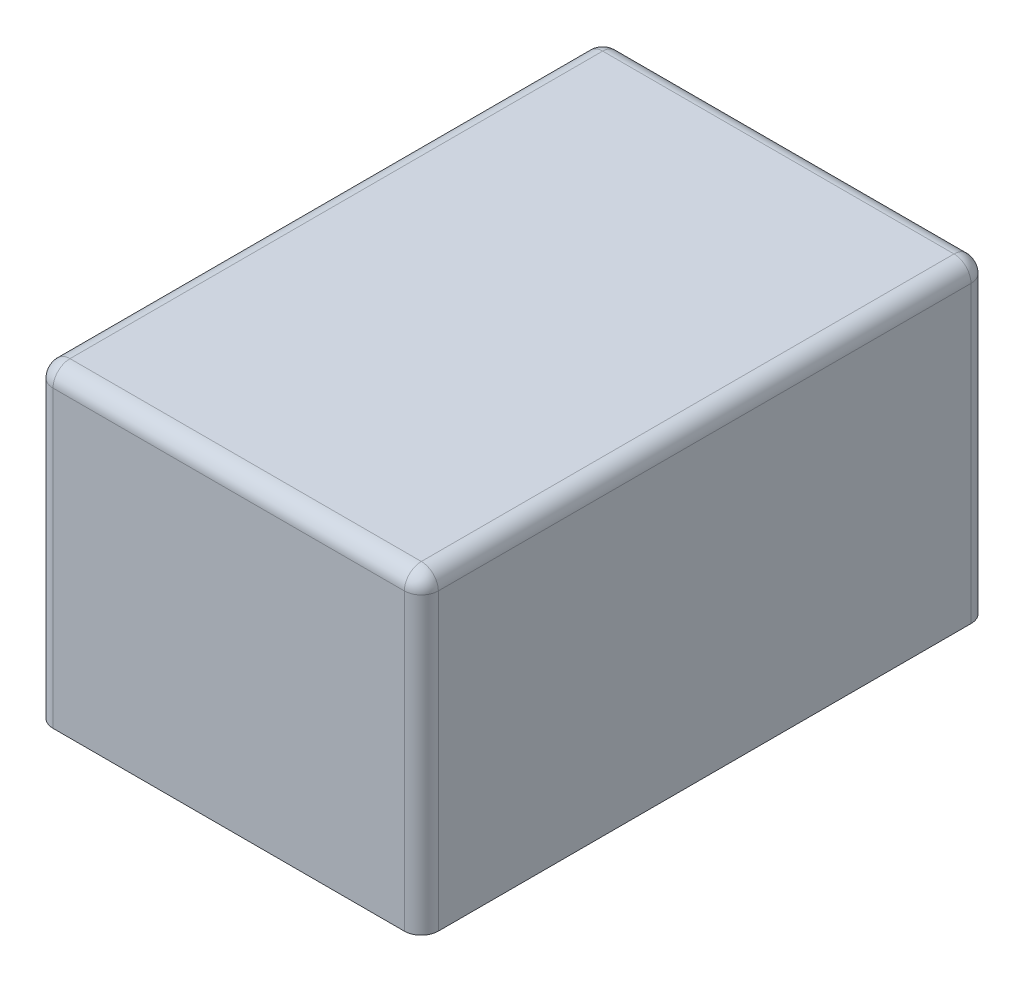
ISO-10303-21;
HEADER;
FILE_DESCRIPTION(('STEP AP214'),'2;1');
FILE_NAME('part.step','',(''),(''),'','','');
FILE_SCHEMA(('AUTOMOTIVE_DESIGN { 1 0 10303 214 1 1 1 1 }'));
ENDSEC;
DATA;
#1=APPLICATION_CONTEXT('core data for automotive mechanical design processes');
#2=APPLICATION_PROTOCOL_DEFINITION('international standard','automotive_design',2000,#1);
#3=PRODUCT_CONTEXT('',#1,'mechanical');
#4=PRODUCT('Part','Part','',(#3));
#5=PRODUCT_RELATED_PRODUCT_CATEGORY('part','',(#4));
#6=PRODUCT_DEFINITION_FORMATION('','',#4);
#7=PRODUCT_DEFINITION_CONTEXT('part definition',#1,'design');
#8=PRODUCT_DEFINITION('design','',#6,#7);
#9=PRODUCT_DEFINITION_SHAPE('','',#8);
#10=(LENGTH_UNIT() NAMED_UNIT(*) SI_UNIT(.MILLI.,.METRE.));
#11=(NAMED_UNIT(*) PLANE_ANGLE_UNIT() SI_UNIT($,.RADIAN.));
#12=(NAMED_UNIT(*) SI_UNIT($,.STERADIAN.) SOLID_ANGLE_UNIT());
#13=UNCERTAINTY_MEASURE_WITH_UNIT(LENGTH_MEASURE(1.E-05),#10,'distance_accuracy_value','');
#14=(GEOMETRIC_REPRESENTATION_CONTEXT(3) GLOBAL_UNCERTAINTY_ASSIGNED_CONTEXT((#13)) GLOBAL_UNIT_ASSIGNED_CONTEXT((#10,
#11,#12)) REPRESENTATION_CONTEXT('',''));
#15=CARTESIAN_POINT('',(0.,0.,0.));
#16=DIRECTION('',(0.,0.,1.));
#17=DIRECTION('',(1.,0.,0.));
#18=AXIS2_PLACEMENT_3D('',#15,#16,#17);
#19=CARTESIAN_POINT('',(0.,0.,100.));
#20=DIRECTION('',(1.,0.,0.));
#21=DIRECTION('',(0.,0.,-1.));
#22=AXIS2_PLACEMENT_3D('',#19,#20,#21);
#23=PLANE('',#22);
#24=DIRECTION('',(0.,0.,-1.));
#25=VECTOR('',#24,1.);
#26=CARTESIAN_POINT('',(0.,0.,100.));
#27=LINE('',#26,#25);
#28=CARTESIAN_POINT('',(0.,0.,97.));
#29=VERTEX_POINT('',#28);
#30=CARTESIAN_POINT('',(0.,0.,3.));
#31=VERTEX_POINT('',#30);
#32=EDGE_CURVE('E159',#29,#31,#27,.T.);
#33=ORIENTED_EDGE('',*,*,#32,.F.);
#34=DIRECTION('',(0.,-1.,0.));
#35=VECTOR('',#34,1.);
#36=CARTESIAN_POINT('',(0.,0.,97.));
#37=LINE('',#36,#35);
#38=CARTESIAN_POINT('',(0.,52.,97.));
#39=VERTEX_POINT('',#38);
#40=EDGE_CURVE('E197',#29,#39,#37,.F.);
#41=ORIENTED_EDGE('',*,*,#40,.T.);
#42=DIRECTION('',(0.,0.,-1.));
#43=VECTOR('',#42,1.);
#44=CARTESIAN_POINT('',(0.,52.,100.));
#45=LINE('',#44,#43);
#46=CARTESIAN_POINT('',(0.,52.,3.));
#47=VERTEX_POINT('',#46);
#48=EDGE_CURVE('E143',#39,#47,#45,.T.);
#49=ORIENTED_EDGE('',*,*,#48,.T.);
#50=DIRECTION('',(0.,-1.,0.));
#51=VECTOR('',#50,1.);
#52=CARTESIAN_POINT('',(0.,0.,3.));
#53=LINE('',#52,#51);
#54=EDGE_CURVE('E192',#47,#31,#53,.T.);
#55=ORIENTED_EDGE('',*,*,#54,.T.);
#56=EDGE_LOOP('',(#33,#41,#49,#55));
#57=FACE_BOUND('',#56,.T.);
#58=ADVANCED_FACE('F44',(#57),#23,.F.);
#59=CARTESIAN_POINT('',(0.,0.,100.));
#60=DIRECTION('',(0.,1.,0.));
#61=DIRECTION('',(0.,0.,1.));
#62=AXIS2_PLACEMENT_3D('',#59,#60,#61);
#63=PLANE('',#62);
#64=DIRECTION('',(1.,0.,0.));
#65=VECTOR('',#64,1.);
#66=CARTESIAN_POINT('',(0.,0.,100.));
#67=LINE('',#66,#65);
#68=CARTESIAN_POINT('',(3.,0.,100.));
#69=VERTEX_POINT('',#68);
#70=CARTESIAN_POINT('',(65.,0.,100.));
#71=VERTEX_POINT('',#70);
#72=EDGE_CURVE('E272',#69,#71,#67,.T.);
#73=ORIENTED_EDGE('',*,*,#72,.F.);
#74=CARTESIAN_POINT('',(3.,0.,97.));
#75=DIRECTION('',(0.,1.,0.));
#76=DIRECTION('',(0.,0.,1.));
#77=AXIS2_PLACEMENT_3D('',#74,#75,#76);
#78=CIRCLE('',#77,3.);
#79=EDGE_CURVE('E11',#69,#29,#78,.F.);
#80=ORIENTED_EDGE('',*,*,#79,.T.);
#81=ORIENTED_EDGE('',*,*,#32,.T.);
#82=CARTESIAN_POINT('',(3.,0.,3.));
#83=DIRECTION('',(0.,1.,0.));
#84=DIRECTION('',(0.,0.,1.));
#85=AXIS2_PLACEMENT_3D('',#82,#83,#84);
#86=CIRCLE('',#85,3.);
#87=CARTESIAN_POINT('',(3.,0.,0.));
#88=VERTEX_POINT('',#87);
#89=EDGE_CURVE('E54',#31,#88,#86,.F.);
#90=ORIENTED_EDGE('',*,*,#89,.T.);
#91=DIRECTION('',(1.,0.,0.));
#92=VECTOR('',#91,1.);
#93=CARTESIAN_POINT('',(0.,0.,0.));
#94=LINE('',#93,#92);
#95=CARTESIAN_POINT('',(65.,0.,0.));
#96=VERTEX_POINT('',#95);
#97=EDGE_CURVE('E268',#88,#96,#94,.T.);
#98=ORIENTED_EDGE('',*,*,#97,.T.);
#99=CARTESIAN_POINT('',(65.,0.,3.));
#100=DIRECTION('',(0.,1.,0.));
#101=DIRECTION('',(0.,0.,1.));
#102=AXIS2_PLACEMENT_3D('',#99,#100,#101);
#103=CIRCLE('',#102,3.);
#104=CARTESIAN_POINT('',(68.,0.,3.));
#105=VERTEX_POINT('',#104);
#106=EDGE_CURVE('E209',#96,#105,#103,.F.);
#107=ORIENTED_EDGE('',*,*,#106,.T.);
#108=DIRECTION('',(0.,0.,-1.));
#109=VECTOR('',#108,1.);
#110=CARTESIAN_POINT('',(68.,0.,100.));
#111=LINE('',#110,#109);
#112=CARTESIAN_POINT('',(68.,0.,97.));
#113=VERTEX_POINT('',#112);
#114=EDGE_CURVE('E163',#113,#105,#111,.T.);
#115=ORIENTED_EDGE('',*,*,#114,.F.);
#116=CARTESIAN_POINT('',(65.,0.,97.));
#117=DIRECTION('',(0.,1.,0.));
#118=DIRECTION('',(0.,0.,1.));
#119=AXIS2_PLACEMENT_3D('',#116,#117,#118);
#120=CIRCLE('',#119,3.);
#121=EDGE_CURVE('E210',#113,#71,#120,.F.);
#122=ORIENTED_EDGE('',*,*,#121,.T.);
#123=EDGE_LOOP('',(#73,#80,#81,#90,#98,#107,#115,#122));
#124=FACE_BOUND('',#123,.T.);
#125=ADVANCED_FACE('F266',(#124),#63,.F.);
#126=CARTESIAN_POINT('',(68.,0.,100.));
#127=DIRECTION('',(-1.,0.,0.));
#128=DIRECTION('',(0.,0.,1.));
#129=AXIS2_PLACEMENT_3D('',#126,#127,#128);
#130=PLANE('',#129);
#131=ORIENTED_EDGE('',*,*,#114,.T.);
#132=DIRECTION('',(0.,1.,0.));
#133=VECTOR('',#132,1.);
#134=CARTESIAN_POINT('',(68.,55.,3.));
#135=LINE('',#134,#133);
#136=CARTESIAN_POINT('',(68.,52.,3.));
#137=VERTEX_POINT('',#136);
#138=EDGE_CURVE('E180',#105,#137,#135,.T.);
#139=ORIENTED_EDGE('',*,*,#138,.T.);
#140=DIRECTION('',(0.,0.,-1.));
#141=VECTOR('',#140,1.);
#142=CARTESIAN_POINT('',(68.,52.,100.));
#143=LINE('',#142,#141);
#144=CARTESIAN_POINT('',(68.,52.,97.));
#145=VERTEX_POINT('',#144);
#146=EDGE_CURVE('E176',#137,#145,#143,.F.);
#147=ORIENTED_EDGE('',*,*,#146,.T.);
#148=DIRECTION('',(0.,1.,0.));
#149=VECTOR('',#148,1.);
#150=CARTESIAN_POINT('',(68.,0.,97.));
#151=LINE('',#150,#149);
#152=EDGE_CURVE('E175',#145,#113,#151,.F.);
#153=ORIENTED_EDGE('',*,*,#152,.T.);
#154=EDGE_LOOP('',(#131,#139,#147,#153));
#155=FACE_BOUND('',#154,.T.);
#156=ADVANCED_FACE('F269',(#155),#130,.F.);
#157=CARTESIAN_POINT('',(0.,55.,100.));
#158=DIRECTION('',(0.,-1.,0.));
#159=DIRECTION('',(0.,0.,-1.));
#160=AXIS2_PLACEMENT_3D('',#157,#158,#159);
#161=PLANE('',#160);
#162=DIRECTION('',(-1.,0.,0.));
#163=VECTOR('',#162,1.);
#164=CARTESIAN_POINT('',(0.,55.,97.));
#165=LINE('',#164,#163);
#166=CARTESIAN_POINT('',(3.,55.,97.));
#167=VERTEX_POINT('',#166);
#168=CARTESIAN_POINT('',(65.,55.,97.));
#169=VERTEX_POINT('',#168);
#170=EDGE_CURVE('E130',#167,#169,#165,.F.);
#171=ORIENTED_EDGE('',*,*,#170,.T.);
#172=DIRECTION('',(0.,0.,-1.));
#173=VECTOR('',#172,1.);
#174=CARTESIAN_POINT('',(65.,55.,100.));
#175=LINE('',#174,#173);
#176=CARTESIAN_POINT('',(65.,55.,3.));
#177=VERTEX_POINT('',#176);
#178=EDGE_CURVE('E168',#169,#177,#175,.T.);
#179=ORIENTED_EDGE('',*,*,#178,.T.);
#180=DIRECTION('',(-1.,0.,0.));
#181=VECTOR('',#180,1.);
#182=CARTESIAN_POINT('',(0.,55.,3.));
#183=LINE('',#182,#181);
#184=CARTESIAN_POINT('',(3.,55.,3.));
#185=VERTEX_POINT('',#184);
#186=EDGE_CURVE('E128',#177,#185,#183,.T.);
#187=ORIENTED_EDGE('',*,*,#186,.T.);
#188=DIRECTION('',(0.,0.,-1.));
#189=VECTOR('',#188,1.);
#190=CARTESIAN_POINT('',(3.,55.,100.));
#191=LINE('',#190,#189);
#192=EDGE_CURVE('E122',#185,#167,#191,.F.);
#193=ORIENTED_EDGE('',*,*,#192,.T.);
#194=EDGE_LOOP('',(#171,#179,#187,#193));
#195=FACE_BOUND('',#194,.T.);
#196=ADVANCED_FACE('F123',(#195),#161,.F.);
#197=CARTESIAN_POINT('',(0.,0.,100.));
#198=DIRECTION('',(0.,0.,-1.));
#199=DIRECTION('',(-1.,0.,0.));
#200=AXIS2_PLACEMENT_3D('',#197,#198,#199);
#201=PLANE('',#200);
#202=DIRECTION('',(-1.,0.,0.));
#203=VECTOR('',#202,1.);
#204=CARTESIAN_POINT('',(0.,52.,100.));
#205=LINE('',#204,#203);
#206=CARTESIAN_POINT('',(65.,52.,100.));
#207=VERTEX_POINT('',#206);
#208=CARTESIAN_POINT('',(3.,52.,100.));
#209=VERTEX_POINT('',#208);
#210=EDGE_CURVE('E65',#207,#209,#205,.T.);
#211=ORIENTED_EDGE('',*,*,#210,.T.);
#212=DIRECTION('',(0.,-1.,0.));
#213=VECTOR('',#212,1.);
#214=CARTESIAN_POINT('',(3.,0.,100.));
#215=LINE('',#214,#213);
#216=EDGE_CURVE('E204',#209,#69,#215,.T.);
#217=ORIENTED_EDGE('',*,*,#216,.T.);
#218=ORIENTED_EDGE('',*,*,#72,.T.);
#219=DIRECTION('',(0.,1.,0.));
#220=VECTOR('',#219,1.);
#221=CARTESIAN_POINT('',(65.,0.,100.));
#222=LINE('',#221,#220);
#223=EDGE_CURVE('E69',#71,#207,#222,.T.);
#224=ORIENTED_EDGE('',*,*,#223,.T.);
#225=EDGE_LOOP('',(#211,#217,#218,#224));
#226=FACE_BOUND('',#225,.T.);
#227=ADVANCED_FACE('F276',(#226),#201,.F.);
#228=CARTESIAN_POINT('',(0.,0.,0.));
#229=DIRECTION('',(0.,0.,-1.));
#230=DIRECTION('',(-1.,0.,0.));
#231=AXIS2_PLACEMENT_3D('',#228,#229,#230);
#232=PLANE('',#231);
#233=ORIENTED_EDGE('',*,*,#97,.F.);
#234=DIRECTION('',(0.,-1.,0.));
#235=VECTOR('',#234,1.);
#236=CARTESIAN_POINT('',(3.,55.,0.));
#237=LINE('',#236,#235);
#238=CARTESIAN_POINT('',(3.,52.,0.));
#239=VERTEX_POINT('',#238);
#240=EDGE_CURVE('E188',#88,#239,#237,.F.);
#241=ORIENTED_EDGE('',*,*,#240,.T.);
#242=DIRECTION('',(-1.,0.,0.));
#243=VECTOR('',#242,1.);
#244=CARTESIAN_POINT('',(68.,52.,0.));
#245=LINE('',#244,#243);
#246=CARTESIAN_POINT('',(65.,52.,0.));
#247=VERTEX_POINT('',#246);
#248=EDGE_CURVE('E189',#239,#247,#245,.F.);
#249=ORIENTED_EDGE('',*,*,#248,.T.);
#250=DIRECTION('',(0.,1.,0.));
#251=VECTOR('',#250,1.);
#252=CARTESIAN_POINT('',(65.,0.,0.));
#253=LINE('',#252,#251);
#254=EDGE_CURVE('E181',#247,#96,#253,.F.);
#255=ORIENTED_EDGE('',*,*,#254,.T.);
#256=EDGE_LOOP('',(#233,#241,#249,#255));
#257=FACE_BOUND('',#256,.T.);
#258=ADVANCED_FACE('F251',(#257),#232,.T.);
#259=CARTESIAN_POINT('',(3.,0.,97.));
#260=DIRECTION('',(0.,-1.,0.));
#261=DIRECTION('',(0.,0.,-1.));
#262=AXIS2_PLACEMENT_3D('',#259,#260,#261);
#263=CYLINDRICAL_SURFACE('',#262,3.);
#264=ORIENTED_EDGE('',*,*,#79,.F.);
#265=ORIENTED_EDGE('',*,*,#216,.F.);
#266=CARTESIAN_POINT('',(3.,52.,97.));
#267=DIRECTION('',(0.,1.,0.));
#268=DIRECTION('',(0.,0.,1.));
#269=AXIS2_PLACEMENT_3D('',#266,#267,#268);
#270=CIRCLE('',#269,3.);
#271=EDGE_CURVE('E47',#39,#209,#270,.T.);
#272=ORIENTED_EDGE('',*,*,#271,.F.);
#273=ORIENTED_EDGE('',*,*,#40,.F.);
#274=EDGE_LOOP('',(#264,#265,#272,#273));
#275=FACE_BOUND('',#274,.T.);
#276=ADVANCED_FACE('F50',(#275),#263,.T.);
#277=CARTESIAN_POINT('',(3.,52.,100.));
#278=DIRECTION('',(0.,0.,-1.));
#279=DIRECTION('',(-1.,0.,0.));
#280=AXIS2_PLACEMENT_3D('',#277,#278,#279);
#281=CYLINDRICAL_SURFACE('',#280,3.);
#282=CARTESIAN_POINT('',(3.,52.,3.));
#283=DIRECTION('',(0.,0.,-1.));
#284=DIRECTION('',(-1.,0.,0.));
#285=AXIS2_PLACEMENT_3D('',#282,#283,#284);
#286=CIRCLE('',#285,3.);
#287=EDGE_CURVE('E148',#47,#185,#286,.T.);
#288=ORIENTED_EDGE('',*,*,#287,.F.);
#289=ORIENTED_EDGE('',*,*,#48,.F.);
#290=CARTESIAN_POINT('',(3.,52.,97.));
#291=DIRECTION('',(0.,0.,1.));
#292=DIRECTION('',(1.,0.,0.));
#293=AXIS2_PLACEMENT_3D('',#290,#291,#292);
#294=CIRCLE('',#293,3.);
#295=EDGE_CURVE('E139',#167,#39,#294,.T.);
#296=ORIENTED_EDGE('',*,*,#295,.F.);
#297=ORIENTED_EDGE('',*,*,#192,.F.);
#298=EDGE_LOOP('',(#288,#289,#296,#297));
#299=FACE_BOUND('',#298,.T.);
#300=ADVANCED_FACE('F140',(#299),#281,.T.);
#301=CARTESIAN_POINT('',(3.,0.,3.));
#302=DIRECTION('',(0.,1.,0.));
#303=DIRECTION('',(0.,0.,1.));
#304=AXIS2_PLACEMENT_3D('',#301,#302,#303);
#305=CYLINDRICAL_SURFACE('',#304,3.);
#306=ORIENTED_EDGE('',*,*,#89,.F.);
#307=ORIENTED_EDGE('',*,*,#54,.F.);
#308=CARTESIAN_POINT('',(3.,52.,3.));
#309=DIRECTION('',(0.,1.,0.));
#310=DIRECTION('',(0.,0.,1.));
#311=AXIS2_PLACEMENT_3D('',#308,#309,#310);
#312=CIRCLE('',#311,3.);
#313=EDGE_CURVE('E155',#239,#47,#312,.T.);
#314=ORIENTED_EDGE('',*,*,#313,.F.);
#315=ORIENTED_EDGE('',*,*,#240,.F.);
#316=EDGE_LOOP('',(#306,#307,#314,#315));
#317=FACE_BOUND('',#316,.T.);
#318=ADVANCED_FACE('F338',(#317),#305,.T.);
#319=CARTESIAN_POINT('',(3.,52.,97.));
#320=DIRECTION('',(-1.,0.,0.));
#321=DIRECTION('',(0.,0.,1.));
#322=AXIS2_PLACEMENT_3D('',#319,#320,#321);
#323=SPHERICAL_SURFACE('',#322,3.);
#324=ORIENTED_EDGE('',*,*,#295,.T.);
#325=ORIENTED_EDGE('',*,*,#271,.T.);
#326=CARTESIAN_POINT('',(3.,52.,97.));
#327=DIRECTION('',(-1.,0.,0.));
#328=DIRECTION('',(0.,0.,1.));
#329=AXIS2_PLACEMENT_3D('',#326,#327,#328);
#330=CIRCLE('',#329,3.);
#331=EDGE_CURVE('E146',#167,#209,#330,.F.);
#332=ORIENTED_EDGE('',*,*,#331,.F.);
#333=EDGE_LOOP('',(#324,#325,#332));
#334=FACE_BOUND('',#333,.T.);
#335=ADVANCED_FACE('F149',(#334),#323,.T.);
#336=CARTESIAN_POINT('',(3.,52.,3.));
#337=DIRECTION('',(-1.,0.,0.));
#338=DIRECTION('',(0.,0.,1.));
#339=AXIS2_PLACEMENT_3D('',#336,#337,#338);
#340=SPHERICAL_SURFACE('',#339,3.);
#341=ORIENTED_EDGE('',*,*,#313,.T.);
#342=ORIENTED_EDGE('',*,*,#287,.T.);
#343=CARTESIAN_POINT('',(3.,52.,3.));
#344=DIRECTION('',(-1.,0.,0.));
#345=DIRECTION('',(0.,0.,1.));
#346=AXIS2_PLACEMENT_3D('',#343,#344,#345);
#347=CIRCLE('',#346,3.);
#348=EDGE_CURVE('E153',#239,#185,#347,.F.);
#349=ORIENTED_EDGE('',*,*,#348,.F.);
#350=EDGE_LOOP('',(#341,#342,#349));
#351=FACE_BOUND('',#350,.T.);
#352=ADVANCED_FACE('F243',(#351),#340,.T.);
#353=CARTESIAN_POINT('',(65.,0.,97.));
#354=DIRECTION('',(0.,1.,0.));
#355=DIRECTION('',(0.,0.,1.));
#356=AXIS2_PLACEMENT_3D('',#353,#354,#355);
#357=CYLINDRICAL_SURFACE('',#356,3.);
#358=ORIENTED_EDGE('',*,*,#121,.F.);
#359=ORIENTED_EDGE('',*,*,#152,.F.);
#360=CARTESIAN_POINT('',(65.,52.,97.));
#361=DIRECTION('',(0.,1.,0.));
#362=DIRECTION('',(0.,0.,1.));
#363=AXIS2_PLACEMENT_3D('',#360,#361,#362);
#364=CIRCLE('',#363,3.);
#365=EDGE_CURVE('E231',#207,#145,#364,.T.);
#366=ORIENTED_EDGE('',*,*,#365,.F.);
#367=ORIENTED_EDGE('',*,*,#223,.F.);
#368=EDGE_LOOP('',(#358,#359,#366,#367));
#369=FACE_BOUND('',#368,.T.);
#370=ADVANCED_FACE('F285',(#369),#357,.T.);
#371=CARTESIAN_POINT('',(0.,52.,97.));
#372=DIRECTION('',(-1.,0.,0.));
#373=DIRECTION('',(0.,0.,1.));
#374=AXIS2_PLACEMENT_3D('',#371,#372,#373);
#375=CYLINDRICAL_SURFACE('',#374,3.);
#376=ORIENTED_EDGE('',*,*,#331,.T.);
#377=ORIENTED_EDGE('',*,*,#210,.F.);
#378=CARTESIAN_POINT('',(65.,52.,97.));
#379=DIRECTION('',(1.,0.,0.));
#380=DIRECTION('',(0.,0.,-1.));
#381=AXIS2_PLACEMENT_3D('',#378,#379,#380);
#382=CIRCLE('',#381,3.);
#383=EDGE_CURVE('E160',#169,#207,#382,.T.);
#384=ORIENTED_EDGE('',*,*,#383,.F.);
#385=ORIENTED_EDGE('',*,*,#170,.F.);
#386=EDGE_LOOP('',(#376,#377,#384,#385));
#387=FACE_BOUND('',#386,.T.);
#388=ADVANCED_FACE('F154',(#387),#375,.T.);
#389=CARTESIAN_POINT('',(0.,52.,3.));
#390=DIRECTION('',(1.,0.,0.));
#391=DIRECTION('',(0.,0.,-1.));
#392=AXIS2_PLACEMENT_3D('',#389,#390,#391);
#393=CYLINDRICAL_SURFACE('',#392,3.);
#394=ORIENTED_EDGE('',*,*,#348,.T.);
#395=ORIENTED_EDGE('',*,*,#186,.F.);
#396=CARTESIAN_POINT('',(65.,52.,3.));
#397=DIRECTION('',(1.,0.,0.));
#398=DIRECTION('',(0.,0.,-1.));
#399=AXIS2_PLACEMENT_3D('',#396,#397,#398);
#400=CIRCLE('',#399,3.);
#401=EDGE_CURVE('E223',#247,#177,#400,.T.);
#402=ORIENTED_EDGE('',*,*,#401,.F.);
#403=ORIENTED_EDGE('',*,*,#248,.F.);
#404=EDGE_LOOP('',(#394,#395,#402,#403));
#405=FACE_BOUND('',#404,.T.);
#406=ADVANCED_FACE('F249',(#405),#393,.T.);
#407=CARTESIAN_POINT('',(65.,0.,3.));
#408=DIRECTION('',(0.,-1.,0.));
#409=DIRECTION('',(0.,0.,-1.));
#410=AXIS2_PLACEMENT_3D('',#407,#408,#409);
#411=CYLINDRICAL_SURFACE('',#410,3.);
#412=ORIENTED_EDGE('',*,*,#106,.F.);
#413=ORIENTED_EDGE('',*,*,#254,.F.);
#414=CARTESIAN_POINT('',(65.,52.,3.));
#415=DIRECTION('',(0.,1.,0.));
#416=DIRECTION('',(0.,0.,1.));
#417=AXIS2_PLACEMENT_3D('',#414,#415,#416);
#418=CIRCLE('',#417,3.);
#419=EDGE_CURVE('E222',#137,#247,#418,.T.);
#420=ORIENTED_EDGE('',*,*,#419,.F.);
#421=ORIENTED_EDGE('',*,*,#138,.F.);
#422=EDGE_LOOP('',(#412,#413,#420,#421));
#423=FACE_BOUND('',#422,.T.);
#424=ADVANCED_FACE('F259',(#423),#411,.T.);
#425=CARTESIAN_POINT('',(65.,52.,97.));
#426=DIRECTION('',(0.,0.,1.));
#427=DIRECTION('',(1.,0.,0.));
#428=AXIS2_PLACEMENT_3D('',#425,#426,#427);
#429=SPHERICAL_SURFACE('',#428,3.);
#430=ORIENTED_EDGE('',*,*,#383,.T.);
#431=ORIENTED_EDGE('',*,*,#365,.T.);
#432=CARTESIAN_POINT('',(65.,52.,97.));
#433=DIRECTION('',(0.,0.,1.));
#434=DIRECTION('',(1.,0.,0.));
#435=AXIS2_PLACEMENT_3D('',#432,#433,#434);
#436=CIRCLE('',#435,3.);
#437=EDGE_CURVE('E217',#169,#145,#436,.F.);
#438=ORIENTED_EDGE('',*,*,#437,.F.);
#439=EDGE_LOOP('',(#430,#431,#438));
#440=FACE_BOUND('',#439,.T.);
#441=ADVANCED_FACE('F282',(#440),#429,.T.);
#442=CARTESIAN_POINT('',(65.,52.,3.));
#443=DIRECTION('',(0.,0.,-1.));
#444=DIRECTION('',(-1.,0.,0.));
#445=AXIS2_PLACEMENT_3D('',#442,#443,#444);
#446=SPHERICAL_SURFACE('',#445,3.);
#447=ORIENTED_EDGE('',*,*,#419,.T.);
#448=ORIENTED_EDGE('',*,*,#401,.T.);
#449=CARTESIAN_POINT('',(65.,52.,3.));
#450=DIRECTION('',(0.,0.,-1.));
#451=DIRECTION('',(-1.,0.,0.));
#452=AXIS2_PLACEMENT_3D('',#449,#450,#451);
#453=CIRCLE('',#452,3.);
#454=EDGE_CURVE('E214',#137,#177,#453,.F.);
#455=ORIENTED_EDGE('',*,*,#454,.F.);
#456=EDGE_LOOP('',(#447,#448,#455));
#457=FACE_BOUND('',#456,.T.);
#458=ADVANCED_FACE('F292',(#457),#446,.T.);
#459=CARTESIAN_POINT('',(65.,52.,100.));
#460=DIRECTION('',(0.,0.,-1.));
#461=DIRECTION('',(-1.,0.,0.));
#462=AXIS2_PLACEMENT_3D('',#459,#460,#461);
#463=CYLINDRICAL_SURFACE('',#462,3.);
#464=ORIENTED_EDGE('',*,*,#437,.T.);
#465=ORIENTED_EDGE('',*,*,#146,.F.);
#466=ORIENTED_EDGE('',*,*,#454,.T.);
#467=ORIENTED_EDGE('',*,*,#178,.F.);
#468=EDGE_LOOP('',(#464,#465,#466,#467));
#469=FACE_BOUND('',#468,.T.);
#470=ADVANCED_FACE('F289',(#469),#463,.T.);
#471=CLOSED_SHELL('',(#58,#125,#156,#196,#227,#258,#276,#300,#318,#335,#352,#370,#388,#406,#424,
#441,#458,#470));
#472=MANIFOLD_SOLID_BREP('B2',#471);
#473=ADVANCED_BREP_SHAPE_REPRESENTATION('',(#18,#472),#14);
#474=SHAPE_DEFINITION_REPRESENTATION(#9,#473);
ENDSEC;
END-ISO-10303-21;
